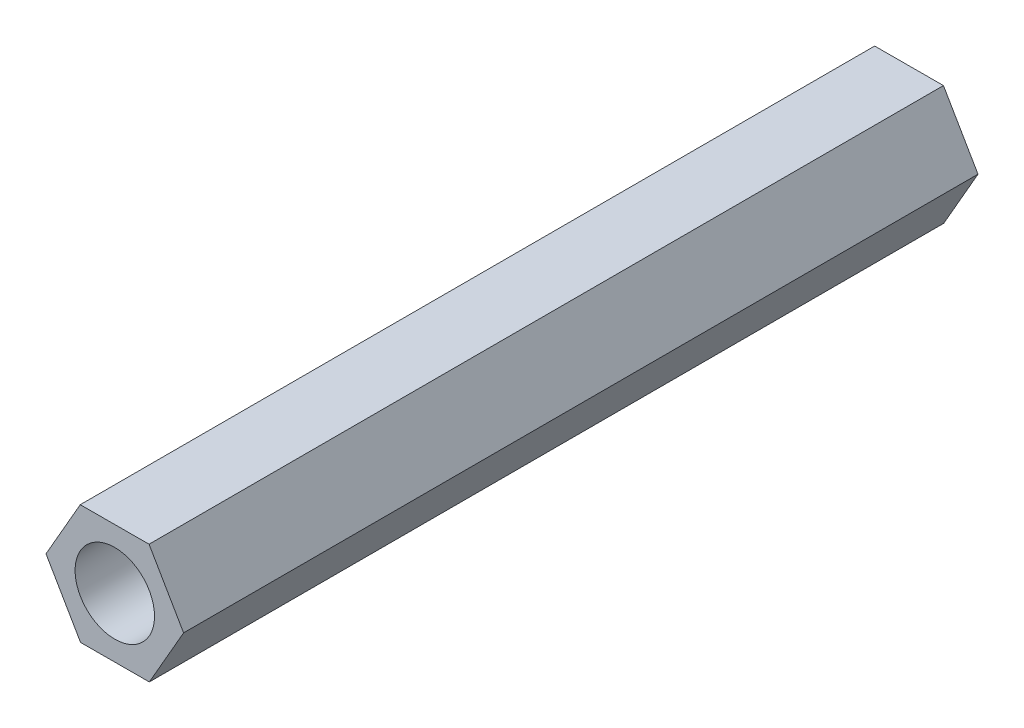
ISO-10303-21;
HEADER;
FILE_DESCRIPTION(('STEP AP214'),'2;1');
FILE_NAME('part.step','',(''),(''),'','','');
FILE_SCHEMA(('AUTOMOTIVE_DESIGN { 1 0 10303 214 1 1 1 1 }'));
ENDSEC;
DATA;
#1=APPLICATION_CONTEXT('core data for automotive mechanical design processes');
#2=APPLICATION_PROTOCOL_DEFINITION('international standard','automotive_design',2000,#1);
#3=PRODUCT_CONTEXT('',#1,'mechanical');
#4=PRODUCT('Part','Part','',(#3));
#5=PRODUCT_RELATED_PRODUCT_CATEGORY('part','',(#4));
#6=PRODUCT_DEFINITION_FORMATION('','',#4);
#7=PRODUCT_DEFINITION_CONTEXT('part definition',#1,'design');
#8=PRODUCT_DEFINITION('design','',#6,#7);
#9=PRODUCT_DEFINITION_SHAPE('','',#8);
#10=(LENGTH_UNIT() NAMED_UNIT(*) SI_UNIT(.MILLI.,.METRE.));
#11=(NAMED_UNIT(*) PLANE_ANGLE_UNIT() SI_UNIT($,.RADIAN.));
#12=(NAMED_UNIT(*) SI_UNIT($,.STERADIAN.) SOLID_ANGLE_UNIT());
#13=UNCERTAINTY_MEASURE_WITH_UNIT(LENGTH_MEASURE(1.E-05),#10,'distance_accuracy_value','');
#14=(GEOMETRIC_REPRESENTATION_CONTEXT(3) GLOBAL_UNCERTAINTY_ASSIGNED_CONTEXT((#13)) GLOBAL_UNIT_ASSIGNED_CONTEXT((#10,
#11,#12)) REPRESENTATION_CONTEXT('',''));
#15=CARTESIAN_POINT('',(0.,0.,0.));
#16=DIRECTION('',(0.,0.,1.));
#17=DIRECTION('',(1.,0.,0.));
#18=AXIS2_PLACEMENT_3D('',#15,#16,#17);
#19=CARTESIAN_POINT('',(0.,0.,40.));
#20=DIRECTION('',(0.,0.,1.));
#21=DIRECTION('',(1.,0.,0.));
#22=AXIS2_PLACEMENT_3D('',#19,#20,#21);
#23=PLANE('',#22);
#24=DIRECTION('',(0.999997197159607,0.00236763023524222,0.));
#25=VECTOR('',#24,1.);
#26=CARTESIAN_POINT('',(-1.72494306220118,-3.0040924473398,40.));
#27=LINE('',#26,#25);
#28=CARTESIAN_POINT('',(-1.72494306220118,-3.0040924473398,40.));
#29=VERTEX_POINT('',#28);
#30=CARTESIAN_POINT('',(1.73914884361264,-2.99589073561785,40.));
#31=VERTEX_POINT('',#30);
#32=EDGE_CURVE('E131',#29,#31,#27,.T.);
#33=ORIENTED_EDGE('',*,*,#32,.T.);
#34=DIRECTION('',(0.497948170649314,0.867206791571077,0.));
#35=VECTOR('',#34,1.);
#36=CARTESIAN_POINT('',(1.73914884361264,-2.99589073561785,40.));
#37=LINE('',#36,#35);
#38=CARTESIAN_POINT('',(3.46409190581382,0.00820171172195195,40.));
#39=VERTEX_POINT('',#38);
#40=EDGE_CURVE('E89',#31,#39,#37,.T.);
#41=ORIENTED_EDGE('',*,*,#40,.T.);
#42=DIRECTION('',(-0.502049026510292,0.864839161335834,0.));
#43=VECTOR('',#42,1.);
#44=CARTESIAN_POINT('',(3.46409190581382,0.00820171172195195,40.));
#45=LINE('',#44,#43);
#46=CARTESIAN_POINT('',(1.72494306220118,3.00409244733979,40.));
#47=VERTEX_POINT('',#46);
#48=EDGE_CURVE('E102',#39,#47,#45,.T.);
#49=ORIENTED_EDGE('',*,*,#48,.T.);
#50=DIRECTION('',(-0.999997197159607,-0.00236763023524222,0.));
#51=VECTOR('',#50,1.);
#52=CARTESIAN_POINT('',(1.72494306220118,3.00409244733979,40.));
#53=LINE('',#52,#51);
#54=CARTESIAN_POINT('',(-1.73914884361264,2.99589073561784,40.));
#55=VERTEX_POINT('',#54);
#56=EDGE_CURVE('E96',#47,#55,#53,.T.);
#57=ORIENTED_EDGE('',*,*,#56,.T.);
#58=DIRECTION('',(-0.497948170649315,-0.867206791571076,0.));
#59=VECTOR('',#58,1.);
#60=CARTESIAN_POINT('',(-1.73914884361264,2.99589073561784,40.));
#61=LINE('',#60,#59);
#62=CARTESIAN_POINT('',(-3.46409190581382,-0.00820171172194793,40.));
#63=VERTEX_POINT('',#62);
#64=EDGE_CURVE('E100',#55,#63,#61,.T.);
#65=ORIENTED_EDGE('',*,*,#64,.T.);
#66=DIRECTION('',(0.502049026510291,-0.864839161335834,0.));
#67=VECTOR('',#66,1.);
#68=CARTESIAN_POINT('',(-3.46409190581382,-0.00820171172194793,40.));
#69=LINE('',#68,#67);
#70=EDGE_CURVE('E52',#63,#29,#69,.T.);
#71=ORIENTED_EDGE('',*,*,#70,.T.);
#72=EDGE_LOOP('',(#33,#41,#49,#57,#65,#71));
#73=FACE_BOUND('',#72,.T.);
#74=CARTESIAN_POINT('',(0.,0.,40.));
#75=DIRECTION('',(0.,0.,1.));
#76=DIRECTION('',(1.,0.,0.));
#77=AXIS2_PLACEMENT_3D('',#74,#75,#76);
#78=CIRCLE('',#77,2.);
#79=CARTESIAN_POINT('',(2.,0.,40.));
#80=VERTEX_POINT('',#79);
#81=EDGE_CURVE('E124',#80,#80,#78,.T.);
#82=ORIENTED_EDGE('',*,*,#81,.F.);
#83=EDGE_LOOP('',(#82));
#84=FACE_BOUND('',#83,.T.);
#85=ADVANCED_FACE('F35',(#73,#84),#23,.T.);
#86=CARTESIAN_POINT('',(0.,0.,0.));
#87=DIRECTION('',(0.,0.,1.));
#88=DIRECTION('',(1.,0.,0.));
#89=AXIS2_PLACEMENT_3D('',#86,#87,#88);
#90=PLANE('',#89);
#91=DIRECTION('',(0.999997197159607,0.00236763023524222,0.));
#92=VECTOR('',#91,1.);
#93=CARTESIAN_POINT('',(-1.72494306220118,-3.0040924473398,0.));
#94=LINE('',#93,#92);
#95=CARTESIAN_POINT('',(-1.72494306220118,-3.0040924473398,0.));
#96=VERTEX_POINT('',#95);
#97=CARTESIAN_POINT('',(1.73914884361264,-2.99589073561785,0.));
#98=VERTEX_POINT('',#97);
#99=EDGE_CURVE('E120',#96,#98,#94,.T.);
#100=ORIENTED_EDGE('',*,*,#99,.F.);
#101=DIRECTION('',(0.502049026510291,-0.864839161335834,0.));
#102=VECTOR('',#101,1.);
#103=CARTESIAN_POINT('',(-3.46409190581382,-0.00820171172194793,0.));
#104=LINE('',#103,#102);
#105=CARTESIAN_POINT('',(-3.46409190581382,-0.00820171172194793,0.));
#106=VERTEX_POINT('',#105);
#107=EDGE_CURVE('E81',#106,#96,#104,.T.);
#108=ORIENTED_EDGE('',*,*,#107,.F.);
#109=DIRECTION('',(-0.497948170649315,-0.867206791571076,0.));
#110=VECTOR('',#109,1.);
#111=CARTESIAN_POINT('',(-1.73914884361264,2.99589073561784,0.));
#112=LINE('',#111,#110);
#113=CARTESIAN_POINT('',(-1.73914884361264,2.99589073561784,0.));
#114=VERTEX_POINT('',#113);
#115=EDGE_CURVE('E75',#114,#106,#112,.T.);
#116=ORIENTED_EDGE('',*,*,#115,.F.);
#117=DIRECTION('',(-0.999997197159607,-0.00236763023524222,0.));
#118=VECTOR('',#117,1.);
#119=CARTESIAN_POINT('',(1.72494306220118,3.00409244733979,0.));
#120=LINE('',#119,#118);
#121=CARTESIAN_POINT('',(1.72494306220118,3.00409244733979,0.));
#122=VERTEX_POINT('',#121);
#123=EDGE_CURVE('E110',#122,#114,#120,.T.);
#124=ORIENTED_EDGE('',*,*,#123,.F.);
#125=DIRECTION('',(-0.502049026510292,0.864839161335834,0.));
#126=VECTOR('',#125,1.);
#127=CARTESIAN_POINT('',(3.46409190581382,0.00820171172195195,0.));
#128=LINE('',#127,#126);
#129=CARTESIAN_POINT('',(3.46409190581382,0.00820171172195195,0.));
#130=VERTEX_POINT('',#129);
#131=EDGE_CURVE('E126',#130,#122,#128,.T.);
#132=ORIENTED_EDGE('',*,*,#131,.F.);
#133=DIRECTION('',(0.497948170649314,0.867206791571077,0.));
#134=VECTOR('',#133,1.);
#135=CARTESIAN_POINT('',(1.73914884361264,-2.99589073561785,0.));
#136=LINE('',#135,#134);
#137=EDGE_CURVE('E123',#98,#130,#136,.T.);
#138=ORIENTED_EDGE('',*,*,#137,.F.);
#139=EDGE_LOOP('',(#100,#108,#116,#124,#132,#138));
#140=FACE_BOUND('',#139,.T.);
#141=CARTESIAN_POINT('',(0.,0.,0.));
#142=DIRECTION('',(0.,0.,1.));
#143=DIRECTION('',(1.,0.,0.));
#144=AXIS2_PLACEMENT_3D('',#141,#142,#143);
#145=CIRCLE('',#144,2.);
#146=CARTESIAN_POINT('',(2.,0.,0.));
#147=VERTEX_POINT('',#146);
#148=EDGE_CURVE('E224',#147,#147,#145,.T.);
#149=ORIENTED_EDGE('',*,*,#148,.T.);
#150=EDGE_LOOP('',(#149));
#151=FACE_BOUND('',#150,.T.);
#152=ADVANCED_FACE('F140',(#140,#151),#90,.F.);
#153=CARTESIAN_POINT('',(-1.72494306220118,-3.0040924473398,40.));
#154=DIRECTION('',(-0.00236763023524222,0.999997197159607,0.));
#155=DIRECTION('',(-0.999997197159607,-0.00236763023524222,0.));
#156=AXIS2_PLACEMENT_3D('',#153,#154,#155);
#157=PLANE('',#156);
#158=ORIENTED_EDGE('',*,*,#99,.T.);
#159=DIRECTION('',(0.,0.,-1.));
#160=VECTOR('',#159,1.);
#161=CARTESIAN_POINT('',(1.73914884361264,-2.99589073561785,40.));
#162=LINE('',#161,#160);
#163=EDGE_CURVE('E11',#31,#98,#162,.T.);
#164=ORIENTED_EDGE('',*,*,#163,.F.);
#165=ORIENTED_EDGE('',*,*,#32,.F.);
#166=DIRECTION('',(0.,0.,-1.));
#167=VECTOR('',#166,1.);
#168=CARTESIAN_POINT('',(-1.72494306220118,-3.0040924473398,40.));
#169=LINE('',#168,#167);
#170=EDGE_CURVE('E116',#29,#96,#169,.T.);
#171=ORIENTED_EDGE('',*,*,#170,.T.);
#172=EDGE_LOOP('',(#158,#164,#165,#171));
#173=FACE_BOUND('',#172,.T.);
#174=ADVANCED_FACE('F37',(#173),#157,.F.);
#175=CARTESIAN_POINT('',(1.73914884361264,-2.99589073561785,40.));
#176=DIRECTION('',(-0.867206791571077,0.497948170649314,0.));
#177=DIRECTION('',(-0.497948170649314,-0.867206791571077,0.));
#178=AXIS2_PLACEMENT_3D('',#175,#176,#177);
#179=PLANE('',#178);
#180=ORIENTED_EDGE('',*,*,#137,.T.);
#181=DIRECTION('',(0.,0.,-1.));
#182=VECTOR('',#181,1.);
#183=CARTESIAN_POINT('',(3.46409190581382,0.00820171172195195,40.));
#184=LINE('',#183,#182);
#185=EDGE_CURVE('E44',#39,#130,#184,.T.);
#186=ORIENTED_EDGE('',*,*,#185,.F.);
#187=ORIENTED_EDGE('',*,*,#40,.F.);
#188=ORIENTED_EDGE('',*,*,#163,.T.);
#189=EDGE_LOOP('',(#180,#186,#187,#188));
#190=FACE_BOUND('',#189,.T.);
#191=ADVANCED_FACE('F165',(#190),#179,.F.);
#192=CARTESIAN_POINT('',(3.46409190581382,0.00820171172195195,40.));
#193=DIRECTION('',(-0.864839161335834,-0.502049026510292,0.));
#194=DIRECTION('',(0.502049026510292,-0.864839161335834,0.));
#195=AXIS2_PLACEMENT_3D('',#192,#193,#194);
#196=PLANE('',#195);
#197=ORIENTED_EDGE('',*,*,#131,.T.);
#198=DIRECTION('',(0.,0.,-1.));
#199=VECTOR('',#198,1.);
#200=CARTESIAN_POINT('',(1.72494306220118,3.00409244733979,40.));
#201=LINE('',#200,#199);
#202=EDGE_CURVE('E111',#47,#122,#201,.T.);
#203=ORIENTED_EDGE('',*,*,#202,.F.);
#204=ORIENTED_EDGE('',*,*,#48,.F.);
#205=ORIENTED_EDGE('',*,*,#185,.T.);
#206=EDGE_LOOP('',(#197,#203,#204,#205));
#207=FACE_BOUND('',#206,.T.);
#208=ADVANCED_FACE('F137',(#207),#196,.F.);
#209=CARTESIAN_POINT('',(1.72494306220118,3.00409244733979,40.));
#210=DIRECTION('',(0.00236763023524222,-0.999997197159607,0.));
#211=DIRECTION('',(0.999997197159607,0.00236763023524222,0.));
#212=AXIS2_PLACEMENT_3D('',#209,#210,#211);
#213=PLANE('',#212);
#214=ORIENTED_EDGE('',*,*,#123,.T.);
#215=DIRECTION('',(0.,0.,-1.));
#216=VECTOR('',#215,1.);
#217=CARTESIAN_POINT('',(-1.73914884361264,2.99589073561784,40.));
#218=LINE('',#217,#216);
#219=EDGE_CURVE('E107',#55,#114,#218,.T.);
#220=ORIENTED_EDGE('',*,*,#219,.F.);
#221=ORIENTED_EDGE('',*,*,#56,.F.);
#222=ORIENTED_EDGE('',*,*,#202,.T.);
#223=EDGE_LOOP('',(#214,#220,#221,#222));
#224=FACE_BOUND('',#223,.T.);
#225=ADVANCED_FACE('F108',(#224),#213,.F.);
#226=CARTESIAN_POINT('',(-1.73914884361264,2.99589073561784,40.));
#227=DIRECTION('',(0.867206791571076,-0.497948170649315,0.));
#228=DIRECTION('',(0.497948170649315,0.867206791571076,0.));
#229=AXIS2_PLACEMENT_3D('',#226,#227,#228);
#230=PLANE('',#229);
#231=ORIENTED_EDGE('',*,*,#115,.T.);
#232=DIRECTION('',(0.,0.,-1.));
#233=VECTOR('',#232,1.);
#234=CARTESIAN_POINT('',(-3.46409190581382,-0.00820171172194793,40.));
#235=LINE('',#234,#233);
#236=EDGE_CURVE('E112',#63,#106,#235,.T.);
#237=ORIENTED_EDGE('',*,*,#236,.F.);
#238=ORIENTED_EDGE('',*,*,#64,.F.);
#239=ORIENTED_EDGE('',*,*,#219,.T.);
#240=EDGE_LOOP('',(#231,#237,#238,#239));
#241=FACE_BOUND('',#240,.T.);
#242=ADVANCED_FACE('F114',(#241),#230,.F.);
#243=CARTESIAN_POINT('',(-3.46409190581382,-0.00820171172194793,40.));
#244=DIRECTION('',(0.864839161335834,0.502049026510291,0.));
#245=DIRECTION('',(-0.502049026510291,0.864839161335834,0.));
#246=AXIS2_PLACEMENT_3D('',#243,#244,#245);
#247=PLANE('',#246);
#248=ORIENTED_EDGE('',*,*,#107,.T.);
#249=ORIENTED_EDGE('',*,*,#170,.F.);
#250=ORIENTED_EDGE('',*,*,#70,.F.);
#251=ORIENTED_EDGE('',*,*,#236,.T.);
#252=EDGE_LOOP('',(#248,#249,#250,#251));
#253=FACE_BOUND('',#252,.T.);
#254=ADVANCED_FACE('F145',(#253),#247,.F.);
#255=CARTESIAN_POINT('',(0.,0.,40.));
#256=DIRECTION('',(0.,0.,-1.));
#257=DIRECTION('',(-1.,0.,0.));
#258=AXIS2_PLACEMENT_3D('',#255,#256,#257);
#259=CYLINDRICAL_SURFACE('',#258,2.);
#260=ORIENTED_EDGE('',*,*,#81,.T.);
#261=EDGE_LOOP('',(#260));
#262=FACE_BOUND('',#261,.T.);
#263=ORIENTED_EDGE('',*,*,#148,.F.);
#264=EDGE_LOOP('',(#263));
#265=FACE_BOUND('',#264,.T.);
#266=ADVANCED_FACE('F147',(#262,#265),#259,.F.);
#267=CLOSED_SHELL('',(#85,#152,#174,#191,#208,#225,#242,#254,#266));
#268=MANIFOLD_SOLID_BREP('B2',#267);
#269=ADVANCED_BREP_SHAPE_REPRESENTATION('',(#18,#268),#14);
#270=SHAPE_DEFINITION_REPRESENTATION(#9,#269);
ENDSEC;
END-ISO-10303-21;
